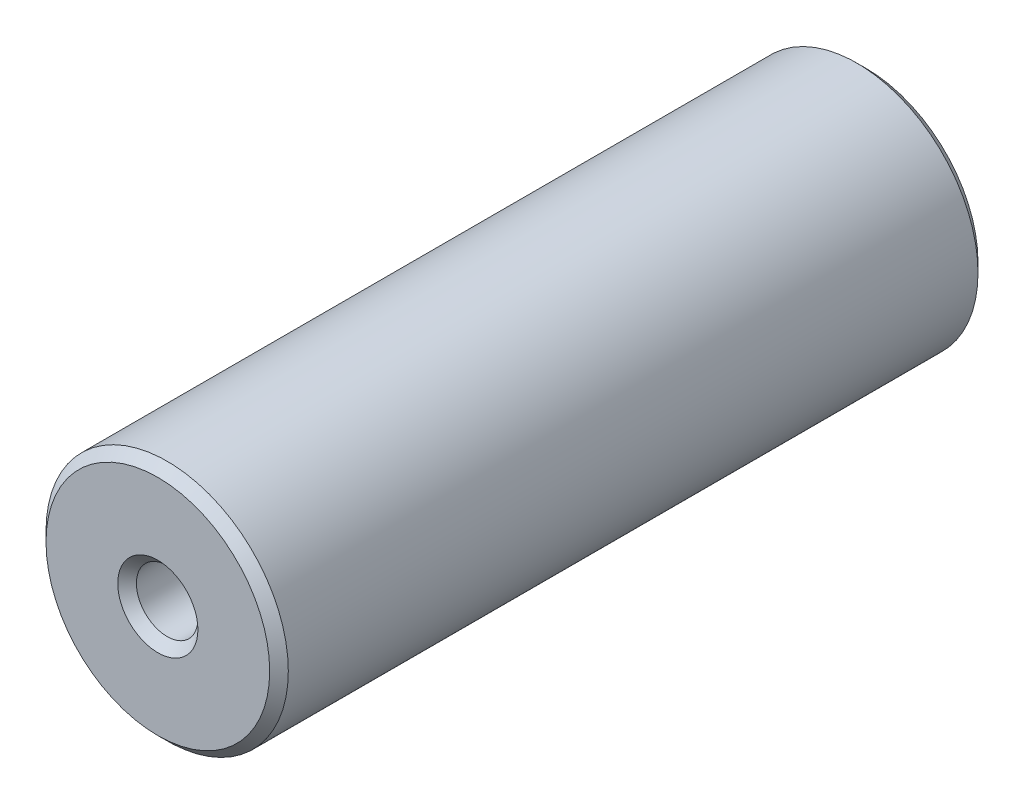
ISO-10303-21;
HEADER;
FILE_DESCRIPTION(('STEP AP214'),'2;1');
FILE_NAME('part.step','',(''),(''),'','','');
FILE_SCHEMA(('AUTOMOTIVE_DESIGN { 1 0 10303 214 1 1 1 1 }'));
ENDSEC;
DATA;
#1=APPLICATION_CONTEXT('core data for automotive mechanical design processes');
#2=APPLICATION_PROTOCOL_DEFINITION('international standard','automotive_design',2000,#1);
#3=PRODUCT_CONTEXT('',#1,'mechanical');
#4=PRODUCT('Part','Part','',(#3));
#5=PRODUCT_RELATED_PRODUCT_CATEGORY('part','',(#4));
#6=PRODUCT_DEFINITION_FORMATION('','',#4);
#7=PRODUCT_DEFINITION_CONTEXT('part definition',#1,'design');
#8=PRODUCT_DEFINITION('design','',#6,#7);
#9=PRODUCT_DEFINITION_SHAPE('','',#8);
#10=(LENGTH_UNIT() NAMED_UNIT(*) SI_UNIT(.MILLI.,.METRE.));
#11=(NAMED_UNIT(*) PLANE_ANGLE_UNIT() SI_UNIT($,.RADIAN.));
#12=(NAMED_UNIT(*) SI_UNIT($,.STERADIAN.) SOLID_ANGLE_UNIT());
#13=UNCERTAINTY_MEASURE_WITH_UNIT(LENGTH_MEASURE(1.E-05),#10,'distance_accuracy_value','');
#14=(GEOMETRIC_REPRESENTATION_CONTEXT(3) GLOBAL_UNCERTAINTY_ASSIGNED_CONTEXT((#13)) GLOBAL_UNIT_ASSIGNED_CONTEXT((#10,
#11,#12)) REPRESENTATION_CONTEXT('',''));
#15=CARTESIAN_POINT('',(0.,0.,0.));
#16=DIRECTION('',(0.,0.,1.));
#17=DIRECTION('',(1.,0.,0.));
#18=AXIS2_PLACEMENT_3D('',#15,#16,#17);
#19=CARTESIAN_POINT('',(0.,0.,76.));
#20=DIRECTION('',(0.,0.,1.));
#21=DIRECTION('',(1.,0.,0.));
#22=AXIS2_PLACEMENT_3D('',#19,#20,#21);
#23=PLANE('',#22);
#24=CARTESIAN_POINT('',(0.,0.,76.));
#25=DIRECTION('',(0.,0.,1.));
#26=DIRECTION('',(1.,0.,0.));
#27=AXIS2_PLACEMENT_3D('',#24,#25,#26);
#28=CIRCLE('',#27,4.3);
#29=CARTESIAN_POINT('',(4.3,0.,76.));
#30=VERTEX_POINT('',#29);
#31=EDGE_CURVE('E42',#30,#30,#28,.F.);
#32=ORIENTED_EDGE('',*,*,#31,.T.);
#33=EDGE_LOOP('',(#32));
#34=FACE_BOUND('',#33,.T.);
#35=CARTESIAN_POINT('',(0.,0.,76.));
#36=DIRECTION('',(0.,0.,1.));
#37=DIRECTION('',(1.,0.,0.));
#38=AXIS2_PLACEMENT_3D('',#35,#36,#37);
#39=CIRCLE('',#38,12.);
#40=CARTESIAN_POINT('',(12.,0.,76.));
#41=VERTEX_POINT('',#40);
#42=EDGE_CURVE('E46',#41,#41,#39,.T.);
#43=ORIENTED_EDGE('',*,*,#42,.T.);
#44=EDGE_LOOP('',(#43));
#45=FACE_BOUND('',#44,.T.);
#46=ADVANCED_FACE('F31',(#34,#45),#23,.T.);
#47=CARTESIAN_POINT('',(0.,0.,0.));
#48=DIRECTION('',(0.,0.,1.));
#49=DIRECTION('',(1.,0.,0.));
#50=AXIS2_PLACEMENT_3D('',#47,#48,#49);
#51=PLANE('',#50);
#52=CARTESIAN_POINT('',(0.,0.,0.));
#53=DIRECTION('',(0.,0.,1.));
#54=DIRECTION('',(1.,0.,0.));
#55=AXIS2_PLACEMENT_3D('',#52,#53,#54);
#56=CIRCLE('',#55,4.3);
#57=CARTESIAN_POINT('',(4.3,0.,0.));
#58=VERTEX_POINT('',#57);
#59=EDGE_CURVE('E57',#58,#58,#56,.T.);
#60=ORIENTED_EDGE('',*,*,#59,.T.);
#61=EDGE_LOOP('',(#60));
#62=FACE_BOUND('',#61,.T.);
#63=CARTESIAN_POINT('',(0.,0.,0.));
#64=DIRECTION('',(0.,0.,1.));
#65=DIRECTION('',(1.,0.,0.));
#66=AXIS2_PLACEMENT_3D('',#63,#64,#65);
#67=CIRCLE('',#66,12.);
#68=CARTESIAN_POINT('',(12.,0.,0.));
#69=VERTEX_POINT('',#68);
#70=EDGE_CURVE('E60',#69,#69,#67,.F.);
#71=ORIENTED_EDGE('',*,*,#70,.T.);
#72=EDGE_LOOP('',(#71));
#73=FACE_BOUND('',#72,.T.);
#74=ADVANCED_FACE('F64',(#62,#73),#51,.F.);
#75=CARTESIAN_POINT('',(0.,0.,76.));
#76=DIRECTION('',(0.,0.,-1.));
#77=DIRECTION('',(-1.,0.,0.));
#78=AXIS2_PLACEMENT_3D('',#75,#76,#77);
#79=CYLINDRICAL_SURFACE('',#78,13.);
#80=CARTESIAN_POINT('',(0.,0.,1.));
#81=DIRECTION('',(0.,0.,1.));
#82=DIRECTION('',(1.,0.,0.));
#83=AXIS2_PLACEMENT_3D('',#80,#81,#82);
#84=CIRCLE('',#83,13.);
#85=CARTESIAN_POINT('',(13.,0.,1.));
#86=VERTEX_POINT('',#85);
#87=EDGE_CURVE('E10',#86,#86,#84,.T.);
#88=ORIENTED_EDGE('',*,*,#87,.T.);
#89=EDGE_LOOP('',(#88));
#90=FACE_BOUND('',#89,.T.);
#91=CARTESIAN_POINT('',(0.,0.,75.));
#92=DIRECTION('',(0.,0.,1.));
#93=DIRECTION('',(1.,0.,0.));
#94=AXIS2_PLACEMENT_3D('',#91,#92,#93);
#95=CIRCLE('',#94,13.);
#96=CARTESIAN_POINT('',(13.,0.,75.));
#97=VERTEX_POINT('',#96);
#98=EDGE_CURVE('E38',#97,#97,#95,.F.);
#99=ORIENTED_EDGE('',*,*,#98,.T.);
#100=EDGE_LOOP('',(#99));
#101=FACE_BOUND('',#100,.T.);
#102=ADVANCED_FACE('F84',(#90,#101),#79,.T.);
#103=CARTESIAN_POINT('',(0.,0.,76.));
#104=DIRECTION('',(0.,0.,-1.));
#105=DIRECTION('',(-1.,0.,0.));
#106=AXIS2_PLACEMENT_3D('',#103,#104,#105);
#107=CYLINDRICAL_SURFACE('',#106,3.3);
#108=CARTESIAN_POINT('',(0.,0.,1.));
#109=DIRECTION('',(0.,0.,1.));
#110=DIRECTION('',(1.,0.,0.));
#111=AXIS2_PLACEMENT_3D('',#108,#109,#110);
#112=CIRCLE('',#111,3.3);
#113=CARTESIAN_POINT('',(3.3,0.,1.));
#114=VERTEX_POINT('',#113);
#115=EDGE_CURVE('E51',#114,#114,#112,.F.);
#116=ORIENTED_EDGE('',*,*,#115,.T.);
#117=EDGE_LOOP('',(#116));
#118=FACE_BOUND('',#117,.T.);
#119=CARTESIAN_POINT('',(0.,0.,75.));
#120=DIRECTION('',(0.,0.,1.));
#121=DIRECTION('',(1.,0.,0.));
#122=AXIS2_PLACEMENT_3D('',#119,#120,#121);
#123=CIRCLE('',#122,3.3);
#124=CARTESIAN_POINT('',(3.3,0.,75.));
#125=VERTEX_POINT('',#124);
#126=EDGE_CURVE('E54',#125,#125,#123,.T.);
#127=ORIENTED_EDGE('',*,*,#126,.T.);
#128=EDGE_LOOP('',(#127));
#129=FACE_BOUND('',#128,.T.);
#130=ADVANCED_FACE('F89',(#118,#129),#107,.F.);
#131=CARTESIAN_POINT('',(0.,0.,0.));
#132=DIRECTION('',(0.,0.,-1.));
#133=DIRECTION('',(-1.,0.,0.));
#134=AXIS2_PLACEMENT_3D('',#131,#132,#133);
#135=CONICAL_SURFACE('',#134,4.3,0.785398163397447);
#136=ORIENTED_EDGE('',*,*,#115,.F.);
#137=EDGE_LOOP('',(#136));
#138=FACE_BOUND('',#137,.T.);
#139=ORIENTED_EDGE('',*,*,#59,.F.);
#140=EDGE_LOOP('',(#139));
#141=FACE_BOUND('',#140,.T.);
#142=ADVANCED_FACE('F75',(#138,#141),#135,.F.);
#143=CARTESIAN_POINT('',(0.,0.,75.));
#144=DIRECTION('',(0.,0.,1.));
#145=DIRECTION('',(1.,0.,0.));
#146=AXIS2_PLACEMENT_3D('',#143,#144,#145);
#147=CONICAL_SURFACE('',#146,3.3,0.785398163397447);
#148=ORIENTED_EDGE('',*,*,#31,.F.);
#149=EDGE_LOOP('',(#148));
#150=FACE_BOUND('',#149,.T.);
#151=ORIENTED_EDGE('',*,*,#126,.F.);
#152=EDGE_LOOP('',(#151));
#153=FACE_BOUND('',#152,.T.);
#154=ADVANCED_FACE('F69',(#150,#153),#147,.F.);
#155=CARTESIAN_POINT('',(0.,0.,1.));
#156=DIRECTION('',(0.,0.,1.));
#157=DIRECTION('',(1.,0.,0.));
#158=AXIS2_PLACEMENT_3D('',#155,#156,#157);
#159=CONICAL_SURFACE('',#158,13.,0.78539816339745);
#160=ORIENTED_EDGE('',*,*,#70,.F.);
#161=EDGE_LOOP('',(#160));
#162=FACE_BOUND('',#161,.T.);
#163=ORIENTED_EDGE('',*,*,#87,.F.);
#164=EDGE_LOOP('',(#163));
#165=FACE_BOUND('',#164,.T.);
#166=ADVANCED_FACE('F66',(#162,#165),#159,.T.);
#167=CARTESIAN_POINT('',(0.,0.,76.));
#168=DIRECTION('',(0.,0.,-1.));
#169=DIRECTION('',(-1.,0.,0.));
#170=AXIS2_PLACEMENT_3D('',#167,#168,#169);
#171=CONICAL_SURFACE('',#170,12.,0.78539816339745);
#172=ORIENTED_EDGE('',*,*,#98,.F.);
#173=EDGE_LOOP('',(#172));
#174=FACE_BOUND('',#173,.T.);
#175=ORIENTED_EDGE('',*,*,#42,.F.);
#176=EDGE_LOOP('',(#175));
#177=FACE_BOUND('',#176,.T.);
#178=ADVANCED_FACE('F33',(#174,#177),#171,.T.);
#179=CLOSED_SHELL('',(#46,#74,#102,#130,#142,#154,#166,#178));
#180=MANIFOLD_SOLID_BREP('B2',#179);
#181=ADVANCED_BREP_SHAPE_REPRESENTATION('',(#18,#180),#14);
#182=SHAPE_DEFINITION_REPRESENTATION(#9,#181);
ENDSEC;
END-ISO-10303-21;
